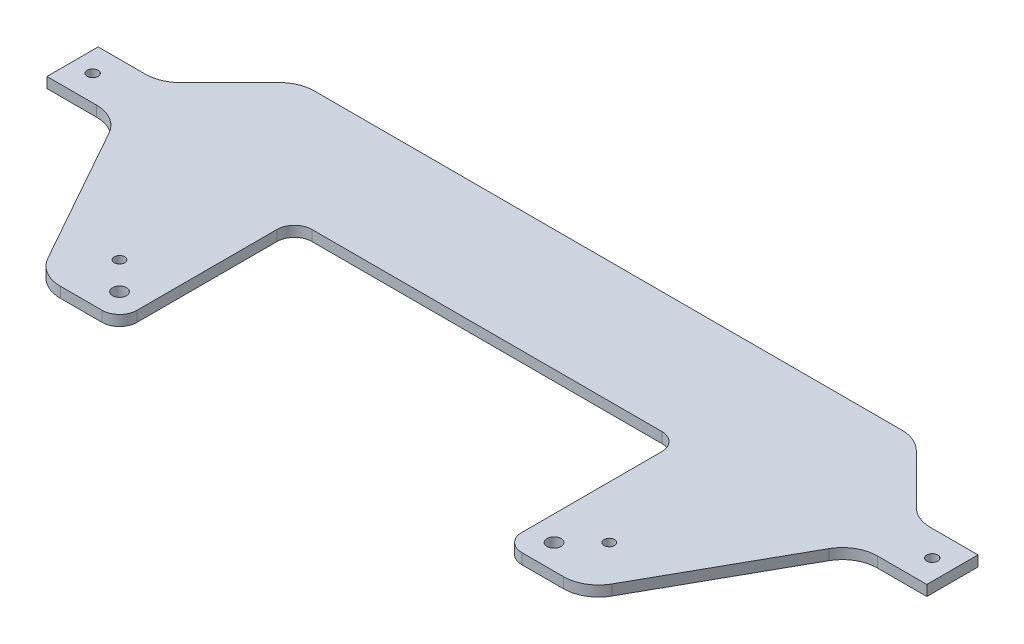
ISO-10303-21;
HEADER;
FILE_DESCRIPTION(('STEP AP214'),'2;1');
FILE_NAME('part.step','',(''),(''),'','','');
FILE_SCHEMA(('AUTOMOTIVE_DESIGN { 1 0 10303 214 1 1 1 1 }'));
ENDSEC;
DATA;
#1=APPLICATION_CONTEXT('core data for automotive mechanical design processes');
#2=APPLICATION_PROTOCOL_DEFINITION('international standard','automotive_design',2000,#1);
#3=PRODUCT_CONTEXT('',#1,'mechanical');
#4=PRODUCT('Part','Part','',(#3));
#5=PRODUCT_RELATED_PRODUCT_CATEGORY('part','',(#4));
#6=PRODUCT_DEFINITION_FORMATION('','',#4);
#7=PRODUCT_DEFINITION_CONTEXT('part definition',#1,'design');
#8=PRODUCT_DEFINITION('design','',#6,#7);
#9=PRODUCT_DEFINITION_SHAPE('','',#8);
#10=(LENGTH_UNIT() NAMED_UNIT(*) SI_UNIT(.MILLI.,.METRE.));
#11=(NAMED_UNIT(*) PLANE_ANGLE_UNIT() SI_UNIT($,.RADIAN.));
#12=(NAMED_UNIT(*) SI_UNIT($,.STERADIAN.) SOLID_ANGLE_UNIT());
#13=UNCERTAINTY_MEASURE_WITH_UNIT(LENGTH_MEASURE(1.E-05),#10,'distance_accuracy_value','');
#14=(GEOMETRIC_REPRESENTATION_CONTEXT(3) GLOBAL_UNCERTAINTY_ASSIGNED_CONTEXT((#13)) GLOBAL_UNIT_ASSIGNED_CONTEXT((#10,
#11,#12)) REPRESENTATION_CONTEXT('',''));
#15=CARTESIAN_POINT('',(0.,0.,0.));
#16=DIRECTION('',(0.,0.,1.));
#17=DIRECTION('',(1.,0.,0.));
#18=AXIS2_PLACEMENT_3D('',#15,#16,#17);
#19=CARTESIAN_POINT('',(-77.75,3.,42.3181711088205));
#20=DIRECTION('',(0.,0.,-1.));
#21=DIRECTION('',(-1.,0.,0.));
#22=AXIS2_PLACEMENT_3D('',#19,#20,#21);
#23=PLANE('',#22);
#24=DIRECTION('',(1.,0.,0.));
#25=VECTOR('',#24,1.);
#26=CARTESIAN_POINT('',(-77.75,0.,42.3181711088205));
#27=LINE('',#26,#25);
#28=CARTESIAN_POINT('',(-71.8887609744845,0.,42.3181711088205));
#29=VERTEX_POINT('',#28);
#30=CARTESIAN_POINT('',(-60.,0.,42.3181711088205));
#31=VERTEX_POINT('',#30);
#32=EDGE_CURVE('E391',#29,#31,#27,.T.);
#33=ORIENTED_EDGE('',*,*,#32,.T.);
#34=DIRECTION('',(0.,1.,0.));
#35=VECTOR('',#34,1.);
#36=CARTESIAN_POINT('',(-60.,3.,42.3181711088205));
#37=LINE('',#36,#35);
#38=CARTESIAN_POINT('',(-60.,3.,42.3181711088205));
#39=VERTEX_POINT('',#38);
#40=EDGE_CURVE('E518',#31,#39,#37,.T.);
#41=ORIENTED_EDGE('',*,*,#40,.T.);
#42=DIRECTION('',(1.,0.,0.));
#43=VECTOR('',#42,1.);
#44=CARTESIAN_POINT('',(-77.75,3.,42.3181711088205));
#45=LINE('',#44,#43);
#46=CARTESIAN_POINT('',(-71.8887609744845,3.,42.3181711088205));
#47=VERTEX_POINT('',#46);
#48=EDGE_CURVE('E352',#47,#39,#45,.T.);
#49=ORIENTED_EDGE('',*,*,#48,.F.);
#50=DIRECTION('',(0.,-1.,0.));
#51=VECTOR('',#50,1.);
#52=CARTESIAN_POINT('',(-71.8887609744845,3.,42.3181711088205));
#53=LINE('',#52,#51);
#54=EDGE_CURVE('E461',#47,#29,#53,.T.);
#55=ORIENTED_EDGE('',*,*,#54,.T.);
#56=EDGE_LOOP('',(#33,#41,#49,#55));
#57=FACE_BOUND('',#56,.T.);
#58=ADVANCED_FACE('F42',(#57),#23,.F.);
#59=CARTESIAN_POINT('',(-88.1,3.,-42.3181711088205));
#60=DIRECTION('',(0.707106781186547,0.,0.707106781186547));
#61=DIRECTION('',(0.707106781186548,0.,-0.707106781186548));
#62=AXIS2_PLACEMENT_3D('',#59,#60,#61);
#63=PLANE('',#62);
#64=DIRECTION('',(-0.707106781186548,0.,0.707106781186548));
#65=VECTOR('',#64,1.);
#66=CARTESIAN_POINT('',(-88.1,3.,-42.3181711088205));
#67=LINE('',#66,#65);
#68=CARTESIAN_POINT('',(-91.0289321881345,3.,-39.389238920686));
#69=VERTEX_POINT('',#68);
#70=CARTESIAN_POINT('',(-105.171067811865,3.,-25.247103296955));
#71=VERTEX_POINT('',#70);
#72=EDGE_CURVE('E345',#69,#71,#67,.T.);
#73=ORIENTED_EDGE('',*,*,#72,.F.);
#74=DIRECTION('',(0.,-1.,0.));
#75=VECTOR('',#74,1.);
#76=CARTESIAN_POINT('',(-91.0289321881345,3.,-39.389238920686));
#77=LINE('',#76,#75);
#78=CARTESIAN_POINT('',(-91.0289321881345,0.,-39.389238920686));
#79=VERTEX_POINT('',#78);
#80=EDGE_CURVE('E455',#69,#79,#77,.T.);
#81=ORIENTED_EDGE('',*,*,#80,.T.);
#82=DIRECTION('',(-0.707106781186548,0.,0.707106781186548));
#83=VECTOR('',#82,1.);
#84=CARTESIAN_POINT('',(-88.1,0.,-42.3181711088205));
#85=LINE('',#84,#83);
#86=CARTESIAN_POINT('',(-105.171067811865,0.,-25.247103296955));
#87=VERTEX_POINT('',#86);
#88=EDGE_CURVE('E339',#79,#87,#85,.T.);
#89=ORIENTED_EDGE('',*,*,#88,.T.);
#90=DIRECTION('',(0.,-1.,0.));
#91=VECTOR('',#90,1.);
#92=CARTESIAN_POINT('',(-105.171067811865,3.,-25.247103296955));
#93=LINE('',#92,#91);
#94=EDGE_CURVE('E448',#87,#71,#93,.F.);
#95=ORIENTED_EDGE('',*,*,#94,.T.);
#96=EDGE_LOOP('',(#73,#81,#89,#95));
#97=FACE_BOUND('',#96,.T.);
#98=ADVANCED_FACE('F608',(#97),#63,.F.);
#99=CARTESIAN_POINT('',(-108.1,3.,-22.3181711088205));
#100=DIRECTION('',(0.,0.,1.));
#101=DIRECTION('',(1.,0.,0.));
#102=AXIS2_PLACEMENT_3D('',#99,#100,#101);
#103=PLANE('',#102);
#104=DIRECTION('',(-1.,0.,0.));
#105=VECTOR('',#104,1.);
#106=CARTESIAN_POINT('',(-108.1,0.,-22.3181711088205));
#107=LINE('',#106,#105);
#108=CARTESIAN_POINT('',(-112.242135623731,0.,-22.3181711088205));
#109=VERTEX_POINT('',#108);
#110=CARTESIAN_POINT('',(-125.75,0.,-22.3181711088205));
#111=VERTEX_POINT('',#110);
#112=EDGE_CURVE('E379',#109,#111,#107,.T.);
#113=ORIENTED_EDGE('',*,*,#112,.T.);
#114=DIRECTION('',(0.,-1.,0.));
#115=VECTOR('',#114,1.);
#116=CARTESIAN_POINT('',(-125.75,3.,-22.3181711088205));
#117=LINE('',#116,#115);
#118=CARTESIAN_POINT('',(-125.75,3.,-22.3181711088205));
#119=VERTEX_POINT('',#118);
#120=EDGE_CURVE('E254',#119,#111,#117,.T.);
#121=ORIENTED_EDGE('',*,*,#120,.F.);
#122=DIRECTION('',(-1.,0.,0.));
#123=VECTOR('',#122,1.);
#124=CARTESIAN_POINT('',(-108.1,3.,-22.3181711088205));
#125=LINE('',#124,#123);
#126=CARTESIAN_POINT('',(-112.242135623731,3.,-22.3181711088205));
#127=VERTEX_POINT('',#126);
#128=EDGE_CURVE('E245',#127,#119,#125,.T.);
#129=ORIENTED_EDGE('',*,*,#128,.F.);
#130=DIRECTION('',(0.,-1.,0.));
#131=VECTOR('',#130,1.);
#132=CARTESIAN_POINT('',(-112.242135623731,0.,-22.3181711088205));
#133=LINE('',#132,#131);
#134=EDGE_CURVE('E490',#127,#109,#133,.T.);
#135=ORIENTED_EDGE('',*,*,#134,.T.);
#136=EDGE_LOOP('',(#113,#121,#129,#135));
#137=FACE_BOUND('',#136,.T.);
#138=ADVANCED_FACE('F598',(#137),#103,.F.);
#139=CARTESIAN_POINT('',(-127.75,3.,-7.6818288911795));
#140=DIRECTION('',(0.,0.,-1.));
#141=DIRECTION('',(-1.,0.,0.));
#142=AXIS2_PLACEMENT_3D('',#139,#140,#141);
#143=PLANE('',#142);
#144=DIRECTION('',(1.,0.,0.));
#145=VECTOR('',#144,1.);
#146=CARTESIAN_POINT('',(-127.75,3.,-7.6818288911795));
#147=LINE('',#146,#145);
#148=CARTESIAN_POINT('',(-125.75,3.,-7.6818288911795));
#149=VERTEX_POINT('',#148);
#150=CARTESIAN_POINT('',(-111.611239025516,3.,-7.6818288911795));
#151=VERTEX_POINT('',#150);
#152=EDGE_CURVE('E233',#149,#151,#147,.T.);
#153=ORIENTED_EDGE('',*,*,#152,.F.);
#154=DIRECTION('',(0.,1.,0.));
#155=VECTOR('',#154,1.);
#156=CARTESIAN_POINT('',(-125.75,0.,-7.6818288911795));
#157=LINE('',#156,#155);
#158=CARTESIAN_POINT('',(-125.75,0.,-7.6818288911795));
#159=VERTEX_POINT('',#158);
#160=EDGE_CURVE('E232',#159,#149,#157,.T.);
#161=ORIENTED_EDGE('',*,*,#160,.F.);
#162=DIRECTION('',(1.,0.,0.));
#163=VECTOR('',#162,1.);
#164=CARTESIAN_POINT('',(-127.75,0.,-7.6818288911795));
#165=LINE('',#164,#163);
#166=CARTESIAN_POINT('',(-111.611239025516,0.,-7.6818288911795));
#167=VERTEX_POINT('',#166);
#168=EDGE_CURVE('E384',#159,#167,#165,.T.);
#169=ORIENTED_EDGE('',*,*,#168,.T.);
#170=DIRECTION('',(0.,-1.,0.));
#171=VECTOR('',#170,1.);
#172=CARTESIAN_POINT('',(-111.611239025516,3.,-7.6818288911795));
#173=LINE('',#172,#171);
#174=EDGE_CURVE('E240',#167,#151,#173,.F.);
#175=ORIENTED_EDGE('',*,*,#174,.T.);
#176=EDGE_LOOP('',(#153,#161,#169,#175));
#177=FACE_BOUND('',#176,.T.);
#178=ADVANCED_FACE('F231',(#177),#143,.F.);
#179=CARTESIAN_POINT('',(-105.75,3.,-7.6818288911795));
#180=DIRECTION('',(0.87250601594972,0.,-0.488603368931844));
#181=DIRECTION('',(-0.488603368931844,0.,-0.87250601594972));
#182=AXIS2_PLACEMENT_3D('',#179,#180,#181);
#183=PLANE('',#182);
#184=DIRECTION('',(0.488603368931844,0.,0.87250601594972));
#185=VECTOR('',#184,1.);
#186=CARTESIAN_POINT('',(-105.75,0.,-7.6818288911795));
#187=LINE('',#186,#185);
#188=CARTESIAN_POINT('',(-102.886178866018,0.,-2.56786258049794));
#189=VERTEX_POINT('',#188);
#190=CARTESIAN_POINT('',(-80.6138211339817,0.,37.2042047981389));
#191=VERTEX_POINT('',#190);
#192=EDGE_CURVE('E389',#189,#191,#187,.T.);
#193=ORIENTED_EDGE('',*,*,#192,.T.);
#194=DIRECTION('',(0.,-1.,0.));
#195=VECTOR('',#194,1.);
#196=CARTESIAN_POINT('',(-80.6138211339817,3.,37.2042047981389));
#197=LINE('',#196,#195);
#198=CARTESIAN_POINT('',(-80.6138211339817,3.,37.2042047981389));
#199=VERTEX_POINT('',#198);
#200=EDGE_CURVE('E469',#191,#199,#197,.F.);
#201=ORIENTED_EDGE('',*,*,#200,.T.);
#202=DIRECTION('',(0.488603368931844,0.,0.87250601594972));
#203=VECTOR('',#202,1.);
#204=CARTESIAN_POINT('',(-105.75,3.,-7.6818288911795));
#205=LINE('',#204,#203);
#206=CARTESIAN_POINT('',(-102.886178866018,3.,-2.56786258049794));
#207=VERTEX_POINT('',#206);
#208=EDGE_CURVE('E241',#207,#199,#205,.T.);
#209=ORIENTED_EDGE('',*,*,#208,.F.);
#210=DIRECTION('',(0.,-1.,0.));
#211=VECTOR('',#210,1.);
#212=CARTESIAN_POINT('',(-102.886178866018,0.,-2.56786258049794));
#213=LINE('',#212,#211);
#214=EDGE_CURVE('E464',#207,#189,#213,.T.);
#215=ORIENTED_EDGE('',*,*,#214,.T.);
#216=EDGE_LOOP('',(#193,#201,#209,#215));
#217=FACE_BOUND('',#216,.T.);
#218=ADVANCED_FACE('F595',(#217),#183,.F.);
#219=CARTESIAN_POINT('',(60.,3.,42.3181711088205));
#220=VERTEX_POINT('',#219);
#221=CARTESIAN_POINT('',(71.8887609744845,3.,42.3181711088205));
#222=VERTEX_POINT('',#221);
#223=EDGE_CURVE('E353',#220,#222,#45,.T.);
#224=ORIENTED_EDGE('',*,*,#223,.F.);
#225=DIRECTION('',(0.,1.,0.));
#226=VECTOR('',#225,1.);
#227=CARTESIAN_POINT('',(60.,3.,42.3181711088205));
#228=LINE('',#227,#226);
#229=CARTESIAN_POINT('',(60.,0.,42.3181711088205));
#230=VERTEX_POINT('',#229);
#231=EDGE_CURVE('E550',#220,#230,#228,.F.);
#232=ORIENTED_EDGE('',*,*,#231,.T.);
#233=CARTESIAN_POINT('',(71.8887609744845,0.,42.3181711088205));
#234=VERTEX_POINT('',#233);
#235=EDGE_CURVE('E387',#230,#234,#27,.T.);
#236=ORIENTED_EDGE('',*,*,#235,.T.);
#237=DIRECTION('',(0.,-1.,0.));
#238=VECTOR('',#237,1.);
#239=CARTESIAN_POINT('',(71.8887609744845,3.,42.3181711088205));
#240=LINE('',#239,#238);
#241=EDGE_CURVE('E460',#234,#222,#240,.F.);
#242=ORIENTED_EDGE('',*,*,#241,.T.);
#243=EDGE_LOOP('',(#224,#232,#236,#242));
#244=FACE_BOUND('',#243,.T.);
#245=ADVANCED_FACE('F678',(#244),#23,.F.);
#246=CARTESIAN_POINT('',(105.75,3.,-7.6818288911795));
#247=DIRECTION('',(-0.87250601594972,0.,-0.488603368931844));
#248=DIRECTION('',(-0.488603368931844,0.,0.87250601594972));
#249=AXIS2_PLACEMENT_3D('',#246,#247,#248);
#250=PLANE('',#249);
#251=DIRECTION('',(0.488603368931844,0.,-0.87250601594972));
#252=VECTOR('',#251,1.);
#253=CARTESIAN_POINT('',(105.75,3.,-7.6818288911795));
#254=LINE('',#253,#252);
#255=CARTESIAN_POINT('',(80.6138211339817,3.,37.2042047981389));
#256=VERTEX_POINT('',#255);
#257=CARTESIAN_POINT('',(102.886178866018,3.,-2.56786258049794));
#258=VERTEX_POINT('',#257);
#259=EDGE_CURVE('E356',#256,#258,#254,.T.);
#260=ORIENTED_EDGE('',*,*,#259,.F.);
#261=DIRECTION('',(0.,-1.,0.));
#262=VECTOR('',#261,1.);
#263=CARTESIAN_POINT('',(80.6138211339817,3.,37.2042047981389));
#264=LINE('',#263,#262);
#265=CARTESIAN_POINT('',(80.6138211339817,0.,37.2042047981389));
#266=VERTEX_POINT('',#265);
#267=EDGE_CURVE('E472',#256,#266,#264,.T.);
#268=ORIENTED_EDGE('',*,*,#267,.T.);
#269=DIRECTION('',(0.488603368931844,0.,-0.87250601594972));
#270=VECTOR('',#269,1.);
#271=CARTESIAN_POINT('',(105.75,0.,-7.6818288911795));
#272=LINE('',#271,#270);
#273=CARTESIAN_POINT('',(102.886178866018,0.,-2.56786258049794));
#274=VERTEX_POINT('',#273);
#275=EDGE_CURVE('E394',#266,#274,#272,.T.);
#276=ORIENTED_EDGE('',*,*,#275,.T.);
#277=DIRECTION('',(0.,-1.,0.));
#278=VECTOR('',#277,1.);
#279=CARTESIAN_POINT('',(102.886178866018,3.,-2.56786258049794));
#280=LINE('',#279,#278);
#281=EDGE_CURVE('E471',#274,#258,#280,.F.);
#282=ORIENTED_EDGE('',*,*,#281,.T.);
#283=EDGE_LOOP('',(#260,#268,#276,#282));
#284=FACE_BOUND('',#283,.T.);
#285=ADVANCED_FACE('F647',(#284),#250,.F.);
#286=CARTESIAN_POINT('',(127.75,3.,-7.6818288911795));
#287=DIRECTION('',(0.,0.,-1.));
#288=DIRECTION('',(-1.,0.,0.));
#289=AXIS2_PLACEMENT_3D('',#286,#287,#288);
#290=PLANE('',#289);
#291=DIRECTION('',(1.,0.,0.));
#292=VECTOR('',#291,1.);
#293=CARTESIAN_POINT('',(127.75,0.,-7.6818288911795));
#294=LINE('',#293,#292);
#295=CARTESIAN_POINT('',(111.611239025516,0.,-7.6818288911795));
#296=VERTEX_POINT('',#295);
#297=CARTESIAN_POINT('',(125.75,0.,-7.6818288911795));
#298=VERTEX_POINT('',#297);
#299=EDGE_CURVE('E397',#296,#298,#294,.T.);
#300=ORIENTED_EDGE('',*,*,#299,.T.);
#301=DIRECTION('',(0.,-1.,0.));
#302=VECTOR('',#301,1.);
#303=CARTESIAN_POINT('',(125.75,3.,-7.6818288911795));
#304=LINE('',#303,#302);
#305=CARTESIAN_POINT('',(125.75,3.,-7.6818288911795));
#306=VERTEX_POINT('',#305);
#307=EDGE_CURVE('E275',#306,#298,#304,.T.);
#308=ORIENTED_EDGE('',*,*,#307,.F.);
#309=DIRECTION('',(1.,0.,0.));
#310=VECTOR('',#309,1.);
#311=CARTESIAN_POINT('',(127.75,3.,-7.6818288911795));
#312=LINE('',#311,#310);
#313=CARTESIAN_POINT('',(111.611239025516,3.,-7.6818288911795));
#314=VERTEX_POINT('',#313);
#315=EDGE_CURVE('E365',#314,#306,#312,.T.);
#316=ORIENTED_EDGE('',*,*,#315,.F.);
#317=DIRECTION('',(0.,-1.,0.));
#318=VECTOR('',#317,1.);
#319=CARTESIAN_POINT('',(111.611239025516,0.,-7.6818288911795));
#320=LINE('',#319,#318);
#321=EDGE_CURVE('E483',#314,#296,#320,.T.);
#322=ORIENTED_EDGE('',*,*,#321,.T.);
#323=EDGE_LOOP('',(#300,#308,#316,#322));
#324=FACE_BOUND('',#323,.T.);
#325=ADVANCED_FACE('F644',(#324),#290,.F.);
#326=CARTESIAN_POINT('',(108.1,3.,-22.3181711088205));
#327=DIRECTION('',(0.,0.,1.));
#328=DIRECTION('',(1.,0.,0.));
#329=AXIS2_PLACEMENT_3D('',#326,#327,#328);
#330=PLANE('',#329);
#331=DIRECTION('',(-1.,0.,0.));
#332=VECTOR('',#331,1.);
#333=CARTESIAN_POINT('',(108.1,3.,-22.3181711088205));
#334=LINE('',#333,#332);
#335=CARTESIAN_POINT('',(125.75,3.,-22.3181711088205));
#336=VERTEX_POINT('',#335);
#337=CARTESIAN_POINT('',(112.242135623731,3.,-22.3181711088205));
#338=VERTEX_POINT('',#337);
#339=EDGE_CURVE('E362',#336,#338,#334,.T.);
#340=ORIENTED_EDGE('',*,*,#339,.F.);
#341=DIRECTION('',(0.,1.,0.));
#342=VECTOR('',#341,1.);
#343=CARTESIAN_POINT('',(125.75,3.,-22.3181711088205));
#344=LINE('',#343,#342);
#345=CARTESIAN_POINT('',(125.75,0.,-22.3181711088205));
#346=VERTEX_POINT('',#345);
#347=EDGE_CURVE('E277',#346,#336,#344,.T.);
#348=ORIENTED_EDGE('',*,*,#347,.F.);
#349=DIRECTION('',(-1.,0.,0.));
#350=VECTOR('',#349,1.);
#351=CARTESIAN_POINT('',(108.1,0.,-22.3181711088205));
#352=LINE('',#351,#350);
#353=CARTESIAN_POINT('',(112.242135623731,0.,-22.3181711088205));
#354=VERTEX_POINT('',#353);
#355=EDGE_CURVE('E405',#346,#354,#352,.T.);
#356=ORIENTED_EDGE('',*,*,#355,.T.);
#357=DIRECTION('',(0.,-1.,0.));
#358=VECTOR('',#357,1.);
#359=CARTESIAN_POINT('',(112.242135623731,3.,-22.3181711088205));
#360=LINE('',#359,#358);
#361=EDGE_CURVE('E477',#354,#338,#360,.F.);
#362=ORIENTED_EDGE('',*,*,#361,.T.);
#363=EDGE_LOOP('',(#340,#348,#356,#362));
#364=FACE_BOUND('',#363,.T.);
#365=ADVANCED_FACE('F639',(#364),#330,.F.);
#366=CARTESIAN_POINT('',(88.1,3.,-42.3181711088205));
#367=DIRECTION('',(-0.707106781186547,0.,0.707106781186547));
#368=DIRECTION('',(0.707106781186548,0.,0.707106781186548));
#369=AXIS2_PLACEMENT_3D('',#366,#367,#368);
#370=PLANE('',#369);
#371=DIRECTION('',(-0.707106781186548,0.,-0.707106781186548));
#372=VECTOR('',#371,1.);
#373=CARTESIAN_POINT('',(88.1,0.,-42.3181711088205));
#374=LINE('',#373,#372);
#375=CARTESIAN_POINT('',(105.171067811865,0.,-25.247103296955));
#376=VERTEX_POINT('',#375);
#377=CARTESIAN_POINT('',(91.0289321881345,0.,-39.389238920686));
#378=VERTEX_POINT('',#377);
#379=EDGE_CURVE('E403',#376,#378,#374,.T.);
#380=ORIENTED_EDGE('',*,*,#379,.T.);
#381=DIRECTION('',(0.,-1.,0.));
#382=VECTOR('',#381,1.);
#383=CARTESIAN_POINT('',(91.0289321881345,3.,-39.389238920686));
#384=LINE('',#383,#382);
#385=CARTESIAN_POINT('',(91.0289321881345,3.,-39.389238920686));
#386=VERTEX_POINT('',#385);
#387=EDGE_CURVE('E434',#378,#386,#384,.F.);
#388=ORIENTED_EDGE('',*,*,#387,.T.);
#389=DIRECTION('',(-0.707106781186548,0.,-0.707106781186548));
#390=VECTOR('',#389,1.);
#391=CARTESIAN_POINT('',(88.1,3.,-42.3181711088205));
#392=LINE('',#391,#390);
#393=CARTESIAN_POINT('',(105.171067811865,3.,-25.247103296955));
#394=VERTEX_POINT('',#393);
#395=EDGE_CURVE('E368',#394,#386,#392,.T.);
#396=ORIENTED_EDGE('',*,*,#395,.F.);
#397=DIRECTION('',(0.,-1.,0.));
#398=VECTOR('',#397,1.);
#399=CARTESIAN_POINT('',(105.171067811865,0.,-25.247103296955));
#400=LINE('',#399,#398);
#401=EDGE_CURVE('E431',#394,#376,#400,.T.);
#402=ORIENTED_EDGE('',*,*,#401,.T.);
#403=EDGE_LOOP('',(#380,#388,#396,#402));
#404=FACE_BOUND('',#403,.T.);
#405=ADVANCED_FACE('F622',(#404),#370,.F.);
#406=CARTESIAN_POINT('',(-88.1,3.,-42.3181711088205));
#407=DIRECTION('',(0.,0.,1.));
#408=DIRECTION('',(1.,0.,0.));
#409=AXIS2_PLACEMENT_3D('',#406,#407,#408);
#410=PLANE('',#409);
#411=DIRECTION('',(-1.,0.,0.));
#412=VECTOR('',#411,1.);
#413=CARTESIAN_POINT('',(-88.1,3.,-42.3181711088205));
#414=LINE('',#413,#412);
#415=CARTESIAN_POINT('',(83.9578643762691,3.,-42.3181711088205));
#416=VERTEX_POINT('',#415);
#417=CARTESIAN_POINT('',(-83.9578643762691,3.,-42.3181711088205));
#418=VERTEX_POINT('',#417);
#419=EDGE_CURVE('E375',#416,#418,#414,.T.);
#420=ORIENTED_EDGE('',*,*,#419,.F.);
#421=DIRECTION('',(0.,-1.,0.));
#422=VECTOR('',#421,1.);
#423=CARTESIAN_POINT('',(83.9578643762691,3.,-42.3181711088205));
#424=LINE('',#423,#422);
#425=CARTESIAN_POINT('',(83.9578643762691,0.,-42.3181711088205));
#426=VERTEX_POINT('',#425);
#427=EDGE_CURVE('E412',#416,#426,#424,.T.);
#428=ORIENTED_EDGE('',*,*,#427,.T.);
#429=DIRECTION('',(-1.,0.,0.));
#430=VECTOR('',#429,1.);
#431=CARTESIAN_POINT('',(-88.1,0.,-42.3181711088205));
#432=LINE('',#431,#430);
#433=CARTESIAN_POINT('',(-83.9578643762691,0.,-42.3181711088205));
#434=VERTEX_POINT('',#433);
#435=EDGE_CURVE('E350',#426,#434,#432,.T.);
#436=ORIENTED_EDGE('',*,*,#435,.T.);
#437=DIRECTION('',(0.,-1.,0.));
#438=VECTOR('',#437,1.);
#439=CARTESIAN_POINT('',(-83.9578643762691,3.,-42.3181711088205));
#440=LINE('',#439,#438);
#441=EDGE_CURVE('E376',#434,#418,#440,.F.);
#442=ORIENTED_EDGE('',*,*,#441,.T.);
#443=EDGE_LOOP('',(#420,#428,#436,#442));
#444=FACE_BOUND('',#443,.T.);
#445=ADVANCED_FACE('F617',(#444),#410,.F.);
#446=CARTESIAN_POINT('',(0.,3.,0.));
#447=DIRECTION('',(0.,1.,0.));
#448=DIRECTION('',(0.,0.,1.));
#449=AXIS2_PLACEMENT_3D('',#446,#447,#448);
#450=PLANE('',#449);
#451=CARTESIAN_POINT('',(62.1,3.,35.21817110882));
#452=DIRECTION('',(0.,-1.,0.));
#453=DIRECTION('',(0.,0.,1.));
#454=AXIS2_PLACEMENT_3D('',#451,#452,#453);
#455=CIRCLE('',#454,2.);
#456=CARTESIAN_POINT('',(62.1,3.,37.21817110882));
#457=VERTEX_POINT('',#456);
#458=EDGE_CURVE('E1001',#457,#457,#455,.T.);
#459=ORIENTED_EDGE('',*,*,#458,.T.);
#460=EDGE_LOOP('',(#459));
#461=FACE_BOUND('',#460,.T.);
#462=CARTESIAN_POINT('',(-62.1,3.,35.21817110882));
#463=DIRECTION('',(0.,1.,0.));
#464=DIRECTION('',(0.,0.,1.));
#465=AXIS2_PLACEMENT_3D('',#462,#463,#464);
#466=CIRCLE('',#465,2.);
#467=CARTESIAN_POINT('',(-62.1,3.,37.21817110882));
#468=VERTEX_POINT('',#467);
#469=EDGE_CURVE('E262',#468,#468,#466,.T.);
#470=ORIENTED_EDGE('',*,*,#469,.F.);
#471=EDGE_LOOP('',(#470));
#472=FACE_BOUND('',#471,.T.);
#473=ORIENTED_EDGE('',*,*,#128,.T.);
#474=DIRECTION('',(0.,0.,-1.));
#475=VECTOR('',#474,1.);
#476=CARTESIAN_POINT('',(-125.75,3.,-7.6818288911795));
#477=LINE('',#476,#475);
#478=EDGE_CURVE('E244',#149,#119,#477,.T.);
#479=ORIENTED_EDGE('',*,*,#478,.F.);
#480=ORIENTED_EDGE('',*,*,#152,.T.);
#481=CARTESIAN_POINT('',(-111.611239025516,3.,2.3181711088205));
#482=DIRECTION('',(0.,1.,0.));
#483=DIRECTION('',(0.,0.,1.));
#484=AXIS2_PLACEMENT_3D('',#481,#482,#483);
#485=CIRCLE('',#484,10.);
#486=EDGE_CURVE('E509',#151,#207,#485,.F.);
#487=ORIENTED_EDGE('',*,*,#486,.T.);
#488=ORIENTED_EDGE('',*,*,#208,.T.);
#489=CARTESIAN_POINT('',(-71.8887609744845,3.,32.3181711088205));
#490=DIRECTION('',(0.,1.,0.));
#491=DIRECTION('',(0.,0.,1.));
#492=AXIS2_PLACEMENT_3D('',#489,#490,#491);
#493=CIRCLE('',#492,10.);
#494=EDGE_CURVE('E441',#199,#47,#493,.T.);
#495=ORIENTED_EDGE('',*,*,#494,.T.);
#496=ORIENTED_EDGE('',*,*,#48,.T.);
#497=CARTESIAN_POINT('',(-60.,3.,37.3181711088205));
#498=DIRECTION('',(0.,1.,0.));
#499=DIRECTION('',(0.,0.,1.));
#500=AXIS2_PLACEMENT_3D('',#497,#498,#499);
#501=CIRCLE('',#500,5.);
#502=CARTESIAN_POINT('',(-55.,3.,37.3181711088205));
#503=VERTEX_POINT('',#502);
#504=EDGE_CURVE('E526',#39,#503,#501,.T.);
#505=ORIENTED_EDGE('',*,*,#504,.T.);
#506=DIRECTION('',(0.,0.,1.));
#507=VECTOR('',#506,1.);
#508=CARTESIAN_POINT('',(-55.,3.,42.3181711088205));
#509=LINE('',#508,#507);
#510=CARTESIAN_POINT('',(-55.,3.,-2.68182889117948));
#511=VERTEX_POINT('',#510);
#512=EDGE_CURVE('E291',#511,#503,#509,.T.);
#513=ORIENTED_EDGE('',*,*,#512,.F.);
#514=CARTESIAN_POINT('',(-50.,3.,-2.68182889117948));
#515=DIRECTION('',(0.,1.,0.));
#516=DIRECTION('',(0.,0.,1.));
#517=AXIS2_PLACEMENT_3D('',#514,#515,#516);
#518=CIRCLE('',#517,5.);
#519=CARTESIAN_POINT('',(-50.,3.,-7.68182889117949));
#520=VERTEX_POINT('',#519);
#521=EDGE_CURVE('E52',#511,#520,#518,.F.);
#522=ORIENTED_EDGE('',*,*,#521,.T.);
#523=DIRECTION('',(-1.,0.,0.));
#524=VECTOR('',#523,1.);
#525=CARTESIAN_POINT('',(-55.,3.,-7.68182889117949));
#526=LINE('',#525,#524);
#527=CARTESIAN_POINT('',(50.,3.,-7.68182889117949));
#528=VERTEX_POINT('',#527);
#529=EDGE_CURVE('E302',#528,#520,#526,.T.);
#530=ORIENTED_EDGE('',*,*,#529,.F.);
#531=CARTESIAN_POINT('',(50.,3.,-2.68182889117949));
#532=DIRECTION('',(0.,1.,0.));
#533=DIRECTION('',(0.,0.,1.));
#534=AXIS2_PLACEMENT_3D('',#531,#532,#533);
#535=CIRCLE('',#534,5.);
#536=CARTESIAN_POINT('',(55.,3.,-2.68182889117949));
#537=VERTEX_POINT('',#536);
#538=EDGE_CURVE('E560',#528,#537,#535,.F.);
#539=ORIENTED_EDGE('',*,*,#538,.T.);
#540=DIRECTION('',(0.,0.,-1.));
#541=VECTOR('',#540,1.);
#542=CARTESIAN_POINT('',(55.,3.,-7.68182889117949));
#543=LINE('',#542,#541);
#544=CARTESIAN_POINT('',(55.,3.,37.3181711088205));
#545=VERTEX_POINT('',#544);
#546=EDGE_CURVE('E288',#545,#537,#543,.T.);
#547=ORIENTED_EDGE('',*,*,#546,.F.);
#548=CARTESIAN_POINT('',(60.,3.,37.3181711088205));
#549=DIRECTION('',(0.,1.,0.));
#550=DIRECTION('',(0.,0.,1.));
#551=AXIS2_PLACEMENT_3D('',#548,#549,#550);
#552=CIRCLE('',#551,5.);
#553=EDGE_CURVE('E523',#545,#220,#552,.T.);
#554=ORIENTED_EDGE('',*,*,#553,.T.);
#555=ORIENTED_EDGE('',*,*,#223,.T.);
#556=CARTESIAN_POINT('',(71.8887609744845,3.,32.3181711088205));
#557=DIRECTION('',(0.,1.,0.));
#558=DIRECTION('',(0.,0.,1.));
#559=AXIS2_PLACEMENT_3D('',#556,#557,#558);
#560=CIRCLE('',#559,10.);
#561=EDGE_CURVE('E438',#222,#256,#560,.T.);
#562=ORIENTED_EDGE('',*,*,#561,.T.);
#563=ORIENTED_EDGE('',*,*,#259,.T.);
#564=CARTESIAN_POINT('',(111.611239025516,3.,2.3181711088205));
#565=DIRECTION('',(0.,1.,0.));
#566=DIRECTION('',(0.,0.,1.));
#567=AXIS2_PLACEMENT_3D('',#564,#565,#566);
#568=CIRCLE('',#567,10.);
#569=EDGE_CURVE('E503',#258,#314,#568,.F.);
#570=ORIENTED_EDGE('',*,*,#569,.T.);
#571=ORIENTED_EDGE('',*,*,#315,.T.);
#572=DIRECTION('',(0.,0.,1.));
#573=VECTOR('',#572,1.);
#574=CARTESIAN_POINT('',(125.75,3.,-7.6818288911795));
#575=LINE('',#574,#573);
#576=EDGE_CURVE('E282',#336,#306,#575,.T.);
#577=ORIENTED_EDGE('',*,*,#576,.F.);
#578=ORIENTED_EDGE('',*,*,#339,.T.);
#579=CARTESIAN_POINT('',(112.242135623731,3.,-32.3181711088205));
#580=DIRECTION('',(0.,1.,0.));
#581=DIRECTION('',(0.,0.,1.));
#582=AXIS2_PLACEMENT_3D('',#579,#580,#581);
#583=CIRCLE('',#582,10.);
#584=EDGE_CURVE('E500',#338,#394,#583,.F.);
#585=ORIENTED_EDGE('',*,*,#584,.T.);
#586=ORIENTED_EDGE('',*,*,#395,.T.);
#587=CARTESIAN_POINT('',(83.9578643762691,3.,-32.3181711088205));
#588=DIRECTION('',(0.,1.,0.));
#589=DIRECTION('',(0.,0.,1.));
#590=AXIS2_PLACEMENT_3D('',#587,#588,#589);
#591=CIRCLE('',#590,10.);
#592=EDGE_CURVE('E450',#386,#416,#591,.T.);
#593=ORIENTED_EDGE('',*,*,#592,.T.);
#594=ORIENTED_EDGE('',*,*,#419,.T.);
#595=CARTESIAN_POINT('',(-83.9578643762691,3.,-32.3181711088205));
#596=DIRECTION('',(0.,1.,0.));
#597=DIRECTION('',(0.,0.,1.));
#598=AXIS2_PLACEMENT_3D('',#595,#596,#597);
#599=CIRCLE('',#598,10.);
#600=EDGE_CURVE('E443',#418,#69,#599,.T.);
#601=ORIENTED_EDGE('',*,*,#600,.T.);
#602=ORIENTED_EDGE('',*,*,#72,.T.);
#603=CARTESIAN_POINT('',(-112.242135623731,3.,-32.3181711088205));
#604=DIRECTION('',(0.,1.,0.));
#605=DIRECTION('',(0.,0.,1.));
#606=AXIS2_PLACEMENT_3D('',#603,#604,#605);
#607=CIRCLE('',#606,10.);
#608=EDGE_CURVE('E519',#71,#127,#607,.F.);
#609=ORIENTED_EDGE('',*,*,#608,.T.);
#610=EDGE_LOOP('',(#473,#479,#480,#487,#488,#495,#496,#505,#513,#522,#530,#539,#547,#554,#555,
#562,#563,#570,#571,#577,#578,#585,#586,#593,#594,#601,#602,#609));
#611=FACE_BOUND('',#610,.T.);
#612=CARTESIAN_POINT('',(-70.,3.,27.3181711088205));
#613=DIRECTION('',(0.,1.,0.));
#614=DIRECTION('',(0.,0.,1.));
#615=AXIS2_PLACEMENT_3D('',#612,#613,#614);
#616=CIRCLE('',#615,1.5);
#617=CARTESIAN_POINT('',(-70.,3.,28.8181711088205));
#618=VERTEX_POINT('',#617);
#619=EDGE_CURVE('E311',#618,#618,#616,.T.);
#620=ORIENTED_EDGE('',*,*,#619,.F.);
#621=EDGE_LOOP('',(#620));
#622=FACE_BOUND('',#621,.T.);
#623=CARTESIAN_POINT('',(-119.996067811865,3.,-15.));
#624=DIRECTION('',(0.,1.,0.));
#625=DIRECTION('',(0.,0.,1.));
#626=AXIS2_PLACEMENT_3D('',#623,#624,#625);
#627=CIRCLE('',#626,1.54999999999999);
#628=CARTESIAN_POINT('',(-119.996067811865,3.,-13.45));
#629=VERTEX_POINT('',#628);
#630=EDGE_CURVE('E318',#629,#629,#627,.T.);
#631=ORIENTED_EDGE('',*,*,#630,.F.);
#632=EDGE_LOOP('',(#631));
#633=FACE_BOUND('',#632,.T.);
#634=CARTESIAN_POINT('',(119.996067811865,3.,-15.));
#635=DIRECTION('',(0.,1.,0.));
#636=DIRECTION('',(0.,0.,1.));
#637=AXIS2_PLACEMENT_3D('',#634,#635,#636);
#638=CIRCLE('',#637,1.54999999999999);
#639=CARTESIAN_POINT('',(119.996067811865,3.,-13.45));
#640=VERTEX_POINT('',#639);
#641=EDGE_CURVE('E328',#640,#640,#638,.T.);
#642=ORIENTED_EDGE('',*,*,#641,.F.);
#643=EDGE_LOOP('',(#642));
#644=FACE_BOUND('',#643,.T.);
#645=CARTESIAN_POINT('',(70.,3.,27.3181711088205));
#646=DIRECTION('',(0.,1.,0.));
#647=DIRECTION('',(0.,0.,1.));
#648=AXIS2_PLACEMENT_3D('',#645,#646,#647);
#649=CIRCLE('',#648,1.5);
#650=CARTESIAN_POINT('',(70.,3.,28.8181711088205));
#651=VERTEX_POINT('',#650);
#652=EDGE_CURVE('E314',#651,#651,#649,.T.);
#653=ORIENTED_EDGE('',*,*,#652,.F.);
#654=EDGE_LOOP('',(#653));
#655=FACE_BOUND('',#654,.T.);
#656=ADVANCED_FACE('F246',(#461,#472,#611,#622,#633,#644,#655),#450,.T.);
#657=CARTESIAN_POINT('',(0.,0.,0.));
#658=DIRECTION('',(0.,1.,0.));
#659=DIRECTION('',(0.,0.,1.));
#660=AXIS2_PLACEMENT_3D('',#657,#658,#659);
#661=PLANE('',#660);
#662=CARTESIAN_POINT('',(62.1,0.,35.21817110882));
#663=DIRECTION('',(0.,-1.,0.));
#664=DIRECTION('',(0.,0.,1.));
#665=AXIS2_PLACEMENT_3D('',#662,#663,#664);
#666=CIRCLE('',#665,2.);
#667=CARTESIAN_POINT('',(62.1,0.,37.21817110882));
#668=VERTEX_POINT('',#667);
#669=EDGE_CURVE('E998',#668,#668,#666,.T.);
#670=ORIENTED_EDGE('',*,*,#669,.F.);
#671=EDGE_LOOP('',(#670));
#672=FACE_BOUND('',#671,.T.);
#673=CARTESIAN_POINT('',(-62.1,0.,35.21817110882));
#674=DIRECTION('',(0.,1.,0.));
#675=DIRECTION('',(0.,0.,1.));
#676=AXIS2_PLACEMENT_3D('',#673,#674,#675);
#677=CIRCLE('',#676,2.);
#678=CARTESIAN_POINT('',(-62.1,0.,37.21817110882));
#679=VERTEX_POINT('',#678);
#680=EDGE_CURVE('E257',#679,#679,#677,.T.);
#681=ORIENTED_EDGE('',*,*,#680,.T.);
#682=EDGE_LOOP('',(#681));
#683=FACE_BOUND('',#682,.T.);
#684=CARTESIAN_POINT('',(-70.,0.,27.3181711088205));
#685=DIRECTION('',(0.,1.,0.));
#686=DIRECTION('',(0.,0.,1.));
#687=AXIS2_PLACEMENT_3D('',#684,#685,#686);
#688=CIRCLE('',#687,1.5);
#689=CARTESIAN_POINT('',(-70.,0.,28.8181711088205));
#690=VERTEX_POINT('',#689);
#691=EDGE_CURVE('E317',#690,#690,#688,.T.);
#692=ORIENTED_EDGE('',*,*,#691,.T.);
#693=EDGE_LOOP('',(#692));
#694=FACE_BOUND('',#693,.T.);
#695=CARTESIAN_POINT('',(-119.996067811865,0.,-15.));
#696=DIRECTION('',(0.,1.,0.));
#697=DIRECTION('',(0.,0.,1.));
#698=AXIS2_PLACEMENT_3D('',#695,#696,#697);
#699=CIRCLE('',#698,1.54999999999999);
#700=CARTESIAN_POINT('',(-119.996067811865,0.,-13.45));
#701=VERTEX_POINT('',#700);
#702=EDGE_CURVE('E323',#701,#701,#699,.T.);
#703=ORIENTED_EDGE('',*,*,#702,.T.);
#704=EDGE_LOOP('',(#703));
#705=FACE_BOUND('',#704,.T.);
#706=CARTESIAN_POINT('',(119.996067811865,0.,-15.));
#707=DIRECTION('',(0.,1.,0.));
#708=DIRECTION('',(0.,0.,1.));
#709=AXIS2_PLACEMENT_3D('',#706,#707,#708);
#710=CIRCLE('',#709,1.54999999999999);
#711=CARTESIAN_POINT('',(119.996067811865,0.,-13.45));
#712=VERTEX_POINT('',#711);
#713=EDGE_CURVE('E301',#712,#712,#710,.T.);
#714=ORIENTED_EDGE('',*,*,#713,.T.);
#715=EDGE_LOOP('',(#714));
#716=FACE_BOUND('',#715,.T.);
#717=CARTESIAN_POINT('',(70.,0.,27.3181711088205));
#718=DIRECTION('',(0.,1.,0.));
#719=DIRECTION('',(0.,0.,1.));
#720=AXIS2_PLACEMENT_3D('',#717,#718,#719);
#721=CIRCLE('',#720,1.5);
#722=CARTESIAN_POINT('',(70.,0.,28.8181711088205));
#723=VERTEX_POINT('',#722);
#724=EDGE_CURVE('E334',#723,#723,#721,.T.);
#725=ORIENTED_EDGE('',*,*,#724,.T.);
#726=EDGE_LOOP('',(#725));
#727=FACE_BOUND('',#726,.T.);
#728=ORIENTED_EDGE('',*,*,#168,.F.);
#729=DIRECTION('',(0.,0.,1.));
#730=VECTOR('',#729,1.);
#731=CARTESIAN_POINT('',(-125.75,0.,-22.3181711088205));
#732=LINE('',#731,#730);
#733=EDGE_CURVE('E260',#111,#159,#732,.T.);
#734=ORIENTED_EDGE('',*,*,#733,.F.);
#735=ORIENTED_EDGE('',*,*,#112,.F.);
#736=CARTESIAN_POINT('',(-112.242135623731,0.,-32.3181711088205));
#737=DIRECTION('',(0.,1.,0.));
#738=DIRECTION('',(0.,0.,1.));
#739=AXIS2_PLACEMENT_3D('',#736,#737,#738);
#740=CIRCLE('',#739,10.);
#741=EDGE_CURVE('E514',#109,#87,#740,.T.);
#742=ORIENTED_EDGE('',*,*,#741,.T.);
#743=ORIENTED_EDGE('',*,*,#88,.F.);
#744=CARTESIAN_POINT('',(-83.9578643762691,0.,-32.3181711088205));
#745=DIRECTION('',(0.,1.,0.));
#746=DIRECTION('',(0.,0.,1.));
#747=AXIS2_PLACEMENT_3D('',#744,#745,#746);
#748=CIRCLE('',#747,10.);
#749=EDGE_CURVE('E424',#79,#434,#748,.F.);
#750=ORIENTED_EDGE('',*,*,#749,.T.);
#751=ORIENTED_EDGE('',*,*,#435,.F.);
#752=CARTESIAN_POINT('',(83.9578643762691,0.,-32.3181711088205));
#753=DIRECTION('',(0.,1.,0.));
#754=DIRECTION('',(0.,0.,1.));
#755=AXIS2_PLACEMENT_3D('',#752,#753,#754);
#756=CIRCLE('',#755,10.);
#757=EDGE_CURVE('E426',#426,#378,#756,.F.);
#758=ORIENTED_EDGE('',*,*,#757,.T.);
#759=ORIENTED_EDGE('',*,*,#379,.F.);
#760=CARTESIAN_POINT('',(112.242135623731,0.,-32.3181711088205));
#761=DIRECTION('',(0.,1.,0.));
#762=DIRECTION('',(0.,0.,1.));
#763=AXIS2_PLACEMENT_3D('',#760,#761,#762);
#764=CIRCLE('',#763,10.);
#765=EDGE_CURVE('E491',#376,#354,#764,.T.);
#766=ORIENTED_EDGE('',*,*,#765,.T.);
#767=ORIENTED_EDGE('',*,*,#355,.F.);
#768=DIRECTION('',(0.,0.,-1.));
#769=VECTOR('',#768,1.);
#770=CARTESIAN_POINT('',(125.75,0.,-22.3181711088205));
#771=LINE('',#770,#769);
#772=EDGE_CURVE('E279',#298,#346,#771,.T.);
#773=ORIENTED_EDGE('',*,*,#772,.F.);
#774=ORIENTED_EDGE('',*,*,#299,.F.);
#775=CARTESIAN_POINT('',(111.611239025516,0.,2.3181711088205));
#776=DIRECTION('',(0.,1.,0.));
#777=DIRECTION('',(0.,0.,1.));
#778=AXIS2_PLACEMENT_3D('',#775,#776,#777);
#779=CIRCLE('',#778,10.);
#780=EDGE_CURVE('E499',#296,#274,#779,.T.);
#781=ORIENTED_EDGE('',*,*,#780,.T.);
#782=ORIENTED_EDGE('',*,*,#275,.F.);
#783=CARTESIAN_POINT('',(71.8887609744845,0.,32.3181711088205));
#784=DIRECTION('',(0.,1.,0.));
#785=DIRECTION('',(0.,0.,1.));
#786=AXIS2_PLACEMENT_3D('',#783,#784,#785);
#787=CIRCLE('',#786,10.);
#788=EDGE_CURVE('E418',#266,#234,#787,.F.);
#789=ORIENTED_EDGE('',*,*,#788,.T.);
#790=ORIENTED_EDGE('',*,*,#235,.F.);
#791=CARTESIAN_POINT('',(60.,0.,37.3181711088205));
#792=DIRECTION('',(0.,1.,0.));
#793=DIRECTION('',(0.,0.,1.));
#794=AXIS2_PLACEMENT_3D('',#791,#792,#793);
#795=CIRCLE('',#794,5.);
#796=CARTESIAN_POINT('',(55.,0.,37.3181711088205));
#797=VERTEX_POINT('',#796);
#798=EDGE_CURVE('E70',#230,#797,#795,.F.);
#799=ORIENTED_EDGE('',*,*,#798,.T.);
#800=DIRECTION('',(0.,0.,-1.));
#801=VECTOR('',#800,1.);
#802=CARTESIAN_POINT('',(55.,0.,-7.68182889117949));
#803=LINE('',#802,#801);
#804=CARTESIAN_POINT('',(55.,0.,-2.68182889117949));
#805=VERTEX_POINT('',#804);
#806=EDGE_CURVE('E287',#797,#805,#803,.T.);
#807=ORIENTED_EDGE('',*,*,#806,.T.);
#808=CARTESIAN_POINT('',(50.,0.,-2.68182889117949));
#809=DIRECTION('',(0.,1.,0.));
#810=DIRECTION('',(0.,0.,1.));
#811=AXIS2_PLACEMENT_3D('',#808,#809,#810);
#812=CIRCLE('',#811,5.);
#813=CARTESIAN_POINT('',(50.,0.,-7.68182889117949));
#814=VERTEX_POINT('',#813);
#815=EDGE_CURVE('E557',#805,#814,#812,.T.);
#816=ORIENTED_EDGE('',*,*,#815,.T.);
#817=DIRECTION('',(-1.,0.,0.));
#818=VECTOR('',#817,1.);
#819=CARTESIAN_POINT('',(-55.,0.,-7.68182889117949));
#820=LINE('',#819,#818);
#821=CARTESIAN_POINT('',(-50.,0.,-7.68182889117949));
#822=VERTEX_POINT('',#821);
#823=EDGE_CURVE('E292',#814,#822,#820,.T.);
#824=ORIENTED_EDGE('',*,*,#823,.T.);
#825=CARTESIAN_POINT('',(-50.,0.,-2.68182889117948));
#826=DIRECTION('',(0.,1.,0.));
#827=DIRECTION('',(0.,0.,1.));
#828=AXIS2_PLACEMENT_3D('',#825,#826,#827);
#829=CIRCLE('',#828,5.);
#830=CARTESIAN_POINT('',(-55.,0.,-2.68182889117948));
#831=VERTEX_POINT('',#830);
#832=EDGE_CURVE('E11',#822,#831,#829,.T.);
#833=ORIENTED_EDGE('',*,*,#832,.T.);
#834=DIRECTION('',(0.,0.,1.));
#835=VECTOR('',#834,1.);
#836=CARTESIAN_POINT('',(-55.,0.,42.3181711088205));
#837=LINE('',#836,#835);
#838=CARTESIAN_POINT('',(-55.,0.,37.3181711088205));
#839=VERTEX_POINT('',#838);
#840=EDGE_CURVE('E300',#831,#839,#837,.T.);
#841=ORIENTED_EDGE('',*,*,#840,.T.);
#842=CARTESIAN_POINT('',(-60.,0.,37.3181711088205));
#843=DIRECTION('',(0.,1.,0.));
#844=DIRECTION('',(0.,0.,1.));
#845=AXIS2_PLACEMENT_3D('',#842,#843,#844);
#846=CIRCLE('',#845,5.);
#847=EDGE_CURVE('E540',#839,#31,#846,.F.);
#848=ORIENTED_EDGE('',*,*,#847,.T.);
#849=ORIENTED_EDGE('',*,*,#32,.F.);
#850=CARTESIAN_POINT('',(-71.8887609744845,0.,32.3181711088205));
#851=DIRECTION('',(0.,1.,0.));
#852=DIRECTION('',(0.,0.,1.));
#853=AXIS2_PLACEMENT_3D('',#850,#851,#852);
#854=CIRCLE('',#853,10.);
#855=EDGE_CURVE('E422',#29,#191,#854,.F.);
#856=ORIENTED_EDGE('',*,*,#855,.T.);
#857=ORIENTED_EDGE('',*,*,#192,.F.);
#858=CARTESIAN_POINT('',(-111.611239025516,0.,2.3181711088205));
#859=DIRECTION('',(0.,1.,0.));
#860=DIRECTION('',(0.,0.,1.));
#861=AXIS2_PLACEMENT_3D('',#858,#859,#860);
#862=CIRCLE('',#861,10.);
#863=EDGE_CURVE('E506',#189,#167,#862,.T.);
#864=ORIENTED_EDGE('',*,*,#863,.T.);
#865=EDGE_LOOP('',(#728,#734,#735,#742,#743,#750,#751,#758,#759,#766,#767,#773,#774,#781,#782,
#789,#790,#799,#807,#816,#824,#833,#841,#848,#849,#856,#857,#864));
#866=FACE_BOUND('',#865,.T.);
#867=ADVANCED_FACE('F573',(#672,#683,#694,#705,#716,#727,#866),#661,.F.);
#868=CARTESIAN_POINT('',(83.9578643762691,3.,-32.3181711088205));
#869=DIRECTION('',(0.,-1.,0.));
#870=DIRECTION('',(0.,0.,-1.));
#871=AXIS2_PLACEMENT_3D('',#868,#869,#870);
#872=CYLINDRICAL_SURFACE('',#871,10.);
#873=ORIENTED_EDGE('',*,*,#592,.F.);
#874=ORIENTED_EDGE('',*,*,#387,.F.);
#875=ORIENTED_EDGE('',*,*,#757,.F.);
#876=ORIENTED_EDGE('',*,*,#427,.F.);
#877=EDGE_LOOP('',(#873,#874,#875,#876));
#878=FACE_BOUND('',#877,.T.);
#879=ADVANCED_FACE('F623',(#878),#872,.T.);
#880=CARTESIAN_POINT('',(-83.9578643762691,3.,-32.3181711088205));
#881=DIRECTION('',(0.,-1.,0.));
#882=DIRECTION('',(0.,0.,-1.));
#883=AXIS2_PLACEMENT_3D('',#880,#881,#882);
#884=CYLINDRICAL_SURFACE('',#883,10.);
#885=ORIENTED_EDGE('',*,*,#600,.F.);
#886=ORIENTED_EDGE('',*,*,#441,.F.);
#887=ORIENTED_EDGE('',*,*,#749,.F.);
#888=ORIENTED_EDGE('',*,*,#80,.F.);
#889=EDGE_LOOP('',(#885,#886,#887,#888));
#890=FACE_BOUND('',#889,.T.);
#891=ADVANCED_FACE('F612',(#890),#884,.T.);
#892=CARTESIAN_POINT('',(-71.8887609744845,3.,32.3181711088205));
#893=DIRECTION('',(0.,-1.,0.));
#894=DIRECTION('',(0.,0.,-1.));
#895=AXIS2_PLACEMENT_3D('',#892,#893,#894);
#896=CYLINDRICAL_SURFACE('',#895,10.);
#897=ORIENTED_EDGE('',*,*,#494,.F.);
#898=ORIENTED_EDGE('',*,*,#200,.F.);
#899=ORIENTED_EDGE('',*,*,#855,.F.);
#900=ORIENTED_EDGE('',*,*,#54,.F.);
#901=EDGE_LOOP('',(#897,#898,#899,#900));
#902=FACE_BOUND('',#901,.T.);
#903=ADVANCED_FACE('F588',(#902),#896,.T.);
#904=CARTESIAN_POINT('',(71.8887609744845,3.,32.3181711088205));
#905=DIRECTION('',(0.,-1.,0.));
#906=DIRECTION('',(0.,0.,-1.));
#907=AXIS2_PLACEMENT_3D('',#904,#905,#906);
#908=CYLINDRICAL_SURFACE('',#907,10.);
#909=ORIENTED_EDGE('',*,*,#561,.F.);
#910=ORIENTED_EDGE('',*,*,#241,.F.);
#911=ORIENTED_EDGE('',*,*,#788,.F.);
#912=ORIENTED_EDGE('',*,*,#267,.F.);
#913=EDGE_LOOP('',(#909,#910,#911,#912));
#914=FACE_BOUND('',#913,.T.);
#915=ADVANCED_FACE('F656',(#914),#908,.T.);
#916=CARTESIAN_POINT('',(112.242135623731,3.,-32.3181711088205));
#917=DIRECTION('',(0.,1.,0.));
#918=DIRECTION('',(0.,0.,1.));
#919=AXIS2_PLACEMENT_3D('',#916,#917,#918);
#920=CYLINDRICAL_SURFACE('',#919,10.);
#921=ORIENTED_EDGE('',*,*,#584,.F.);
#922=ORIENTED_EDGE('',*,*,#361,.F.);
#923=ORIENTED_EDGE('',*,*,#765,.F.);
#924=ORIENTED_EDGE('',*,*,#401,.F.);
#925=EDGE_LOOP('',(#921,#922,#923,#924));
#926=FACE_BOUND('',#925,.T.);
#927=ADVANCED_FACE('F629',(#926),#920,.F.);
#928=CARTESIAN_POINT('',(111.611239025516,3.,2.3181711088205));
#929=DIRECTION('',(0.,1.,0.));
#930=DIRECTION('',(0.,0.,1.));
#931=AXIS2_PLACEMENT_3D('',#928,#929,#930);
#932=CYLINDRICAL_SURFACE('',#931,10.);
#933=ORIENTED_EDGE('',*,*,#569,.F.);
#934=ORIENTED_EDGE('',*,*,#281,.F.);
#935=ORIENTED_EDGE('',*,*,#780,.F.);
#936=ORIENTED_EDGE('',*,*,#321,.F.);
#937=EDGE_LOOP('',(#933,#934,#935,#936));
#938=FACE_BOUND('',#937,.T.);
#939=ADVANCED_FACE('F653',(#938),#932,.F.);
#940=CARTESIAN_POINT('',(-111.611239025516,3.,2.3181711088205));
#941=DIRECTION('',(0.,1.,0.));
#942=DIRECTION('',(0.,0.,1.));
#943=AXIS2_PLACEMENT_3D('',#940,#941,#942);
#944=CYLINDRICAL_SURFACE('',#943,10.);
#945=ORIENTED_EDGE('',*,*,#486,.F.);
#946=ORIENTED_EDGE('',*,*,#174,.F.);
#947=ORIENTED_EDGE('',*,*,#863,.F.);
#948=ORIENTED_EDGE('',*,*,#214,.F.);
#949=EDGE_LOOP('',(#945,#946,#947,#948));
#950=FACE_BOUND('',#949,.T.);
#951=ADVANCED_FACE('F597',(#950),#944,.F.);
#952=CARTESIAN_POINT('',(-112.242135623731,3.,-32.3181711088205));
#953=DIRECTION('',(0.,1.,0.));
#954=DIRECTION('',(0.,0.,1.));
#955=AXIS2_PLACEMENT_3D('',#952,#953,#954);
#956=CYLINDRICAL_SURFACE('',#955,10.);
#957=ORIENTED_EDGE('',*,*,#608,.F.);
#958=ORIENTED_EDGE('',*,*,#94,.F.);
#959=ORIENTED_EDGE('',*,*,#741,.F.);
#960=ORIENTED_EDGE('',*,*,#134,.F.);
#961=EDGE_LOOP('',(#957,#958,#959,#960));
#962=FACE_BOUND('',#961,.T.);
#963=ADVANCED_FACE('F603',(#962),#956,.F.);
#964=CARTESIAN_POINT('',(70.,0.,27.3181711088205));
#965=DIRECTION('',(0.,1.,0.));
#966=DIRECTION('',(0.,0.,1.));
#967=AXIS2_PLACEMENT_3D('',#964,#965,#966);
#968=CYLINDRICAL_SURFACE('',#967,1.5);
#969=ORIENTED_EDGE('',*,*,#724,.F.);
#970=EDGE_LOOP('',(#969));
#971=FACE_BOUND('',#970,.T.);
#972=ORIENTED_EDGE('',*,*,#652,.T.);
#973=EDGE_LOOP('',(#972));
#974=FACE_BOUND('',#973,.T.);
#975=ADVANCED_FACE('F716',(#971,#974),#968,.F.);
#976=CARTESIAN_POINT('',(119.996067811865,0.,-15.));
#977=DIRECTION('',(0.,1.,0.));
#978=DIRECTION('',(0.,0.,1.));
#979=AXIS2_PLACEMENT_3D('',#976,#977,#978);
#980=CYLINDRICAL_SURFACE('',#979,1.54999999999999);
#981=ORIENTED_EDGE('',*,*,#713,.F.);
#982=EDGE_LOOP('',(#981));
#983=FACE_BOUND('',#982,.T.);
#984=ORIENTED_EDGE('',*,*,#641,.T.);
#985=EDGE_LOOP('',(#984));
#986=FACE_BOUND('',#985,.T.);
#987=ADVANCED_FACE('F733',(#983,#986),#980,.F.);
#988=CARTESIAN_POINT('',(-119.996067811865,0.,-15.));
#989=DIRECTION('',(0.,1.,0.));
#990=DIRECTION('',(0.,0.,1.));
#991=AXIS2_PLACEMENT_3D('',#988,#989,#990);
#992=CYLINDRICAL_SURFACE('',#991,1.54999999999999);
#993=ORIENTED_EDGE('',*,*,#702,.F.);
#994=EDGE_LOOP('',(#993));
#995=FACE_BOUND('',#994,.T.);
#996=ORIENTED_EDGE('',*,*,#630,.T.);
#997=EDGE_LOOP('',(#996));
#998=FACE_BOUND('',#997,.T.);
#999=ADVANCED_FACE('F728',(#995,#998),#992,.F.);
#1000=CARTESIAN_POINT('',(-70.,0.,27.3181711088205));
#1001=DIRECTION('',(0.,1.,0.));
#1002=DIRECTION('',(0.,0.,1.));
#1003=AXIS2_PLACEMENT_3D('',#1000,#1001,#1002);
#1004=CYLINDRICAL_SURFACE('',#1003,1.5);
#1005=ORIENTED_EDGE('',*,*,#691,.F.);
#1006=EDGE_LOOP('',(#1005));
#1007=FACE_BOUND('',#1006,.T.);
#1008=ORIENTED_EDGE('',*,*,#619,.T.);
#1009=EDGE_LOOP('',(#1008));
#1010=FACE_BOUND('',#1009,.T.);
#1011=ADVANCED_FACE('F726',(#1007,#1010),#1004,.F.);
#1012=CARTESIAN_POINT('',(-55.,0.,42.3181711088205));
#1013=DIRECTION('',(-1.,0.,0.));
#1014=DIRECTION('',(0.,0.,1.));
#1015=AXIS2_PLACEMENT_3D('',#1012,#1013,#1014);
#1016=PLANE('',#1015);
#1017=ORIENTED_EDGE('',*,*,#512,.T.);
#1018=DIRECTION('',(0.,1.,0.));
#1019=VECTOR('',#1018,1.);
#1020=CARTESIAN_POINT('',(-55.,0.,37.3181711088205));
#1021=LINE('',#1020,#1019);
#1022=EDGE_CURVE('E531',#503,#839,#1021,.F.);
#1023=ORIENTED_EDGE('',*,*,#1022,.T.);
#1024=ORIENTED_EDGE('',*,*,#840,.F.);
#1025=DIRECTION('',(0.,1.,0.));
#1026=VECTOR('',#1025,1.);
#1027=CARTESIAN_POINT('',(-55.,3.,-2.68182889117948));
#1028=LINE('',#1027,#1026);
#1029=EDGE_CURVE('E527',#831,#511,#1028,.T.);
#1030=ORIENTED_EDGE('',*,*,#1029,.T.);
#1031=EDGE_LOOP('',(#1017,#1023,#1024,#1030));
#1032=FACE_BOUND('',#1031,.T.);
#1033=ADVANCED_FACE('F580',(#1032),#1016,.F.);
#1034=CARTESIAN_POINT('',(-55.,0.,-7.68182889117949));
#1035=DIRECTION('',(0.,0.,-1.));
#1036=DIRECTION('',(-1.,0.,0.));
#1037=AXIS2_PLACEMENT_3D('',#1034,#1035,#1036);
#1038=PLANE('',#1037);
#1039=ORIENTED_EDGE('',*,*,#823,.F.);
#1040=DIRECTION('',(0.,1.,0.));
#1041=VECTOR('',#1040,1.);
#1042=CARTESIAN_POINT('',(50.,3.,-7.68182889117949));
#1043=LINE('',#1042,#1041);
#1044=EDGE_CURVE('E551',#814,#528,#1043,.T.);
#1045=ORIENTED_EDGE('',*,*,#1044,.T.);
#1046=ORIENTED_EDGE('',*,*,#529,.T.);
#1047=DIRECTION('',(0.,1.,0.));
#1048=VECTOR('',#1047,1.);
#1049=CARTESIAN_POINT('',(-50.,0.,-7.68182889117949));
#1050=LINE('',#1049,#1048);
#1051=EDGE_CURVE('E549',#520,#822,#1050,.F.);
#1052=ORIENTED_EDGE('',*,*,#1051,.T.);
#1053=EDGE_LOOP('',(#1039,#1045,#1046,#1052));
#1054=FACE_BOUND('',#1053,.T.);
#1055=ADVANCED_FACE('F569',(#1054),#1038,.F.);
#1056=CARTESIAN_POINT('',(55.,0.,-7.68182889117949));
#1057=DIRECTION('',(1.,0.,0.));
#1058=DIRECTION('',(0.,0.,-1.));
#1059=AXIS2_PLACEMENT_3D('',#1056,#1057,#1058);
#1060=PLANE('',#1059);
#1061=ORIENTED_EDGE('',*,*,#806,.F.);
#1062=DIRECTION('',(0.,1.,0.));
#1063=VECTOR('',#1062,1.);
#1064=CARTESIAN_POINT('',(55.,0.,37.3181711088205));
#1065=LINE('',#1064,#1063);
#1066=EDGE_CURVE('E543',#797,#545,#1065,.T.);
#1067=ORIENTED_EDGE('',*,*,#1066,.T.);
#1068=ORIENTED_EDGE('',*,*,#546,.T.);
#1069=DIRECTION('',(0.,1.,0.));
#1070=VECTOR('',#1069,1.);
#1071=CARTESIAN_POINT('',(55.,0.,-2.68182889117949));
#1072=LINE('',#1071,#1070);
#1073=EDGE_CURVE('E58',#537,#805,#1072,.F.);
#1074=ORIENTED_EDGE('',*,*,#1073,.T.);
#1075=EDGE_LOOP('',(#1061,#1067,#1068,#1074));
#1076=FACE_BOUND('',#1075,.T.);
#1077=ADVANCED_FACE('F663',(#1076),#1060,.F.);
#1078=CARTESIAN_POINT('',(-60.,3.,37.3181711088205));
#1079=DIRECTION('',(0.,1.,0.));
#1080=DIRECTION('',(0.,0.,1.));
#1081=AXIS2_PLACEMENT_3D('',#1078,#1079,#1080);
#1082=CYLINDRICAL_SURFACE('',#1081,5.);
#1083=ORIENTED_EDGE('',*,*,#847,.F.);
#1084=ORIENTED_EDGE('',*,*,#1022,.F.);
#1085=ORIENTED_EDGE('',*,*,#504,.F.);
#1086=ORIENTED_EDGE('',*,*,#40,.F.);
#1087=EDGE_LOOP('',(#1083,#1084,#1085,#1086));
#1088=FACE_BOUND('',#1087,.T.);
#1089=ADVANCED_FACE('F578',(#1088),#1082,.T.);
#1090=CARTESIAN_POINT('',(60.,0.,37.3181711088205));
#1091=DIRECTION('',(0.,1.,0.));
#1092=DIRECTION('',(0.,0.,1.));
#1093=AXIS2_PLACEMENT_3D('',#1090,#1091,#1092);
#1094=CYLINDRICAL_SURFACE('',#1093,5.);
#1095=ORIENTED_EDGE('',*,*,#798,.F.);
#1096=ORIENTED_EDGE('',*,*,#231,.F.);
#1097=ORIENTED_EDGE('',*,*,#553,.F.);
#1098=ORIENTED_EDGE('',*,*,#1066,.F.);
#1099=EDGE_LOOP('',(#1095,#1096,#1097,#1098));
#1100=FACE_BOUND('',#1099,.T.);
#1101=ADVANCED_FACE('F661',(#1100),#1094,.T.);
#1102=CARTESIAN_POINT('',(50.,0.,-2.68182889117949));
#1103=DIRECTION('',(0.,-1.,0.));
#1104=DIRECTION('',(0.,0.,-1.));
#1105=AXIS2_PLACEMENT_3D('',#1102,#1103,#1104);
#1106=CYLINDRICAL_SURFACE('',#1105,5.);
#1107=ORIENTED_EDGE('',*,*,#815,.F.);
#1108=ORIENTED_EDGE('',*,*,#1073,.F.);
#1109=ORIENTED_EDGE('',*,*,#538,.F.);
#1110=ORIENTED_EDGE('',*,*,#1044,.F.);
#1111=EDGE_LOOP('',(#1107,#1108,#1109,#1110));
#1112=FACE_BOUND('',#1111,.T.);
#1113=ADVANCED_FACE('F668',(#1112),#1106,.F.);
#1114=CARTESIAN_POINT('',(-50.,0.,-2.68182889117948));
#1115=DIRECTION('',(0.,-1.,0.));
#1116=DIRECTION('',(0.,0.,-1.));
#1117=AXIS2_PLACEMENT_3D('',#1114,#1115,#1116);
#1118=CYLINDRICAL_SURFACE('',#1117,5.);
#1119=ORIENTED_EDGE('',*,*,#832,.F.);
#1120=ORIENTED_EDGE('',*,*,#1051,.F.);
#1121=ORIENTED_EDGE('',*,*,#521,.F.);
#1122=ORIENTED_EDGE('',*,*,#1029,.F.);
#1123=EDGE_LOOP('',(#1119,#1120,#1121,#1122));
#1124=FACE_BOUND('',#1123,.T.);
#1125=ADVANCED_FACE('F46',(#1124),#1118,.F.);
#1126=CARTESIAN_POINT('',(125.75,0.,0.));
#1127=DIRECTION('',(-1.,0.,0.));
#1128=DIRECTION('',(0.,0.,1.));
#1129=AXIS2_PLACEMENT_3D('',#1126,#1127,#1128);
#1130=PLANE('',#1129);
#1131=ORIENTED_EDGE('',*,*,#307,.T.);
#1132=ORIENTED_EDGE('',*,*,#772,.T.);
#1133=ORIENTED_EDGE('',*,*,#347,.T.);
#1134=ORIENTED_EDGE('',*,*,#576,.T.);
#1135=EDGE_LOOP('',(#1131,#1132,#1133,#1134));
#1136=FACE_BOUND('',#1135,.T.);
#1137=ADVANCED_FACE('F640',(#1136),#1130,.F.);
#1138=CARTESIAN_POINT('',(-125.75,0.,0.));
#1139=DIRECTION('',(-1.,0.,0.));
#1140=DIRECTION('',(0.,0.,1.));
#1141=AXIS2_PLACEMENT_3D('',#1138,#1139,#1140);
#1142=PLANE('',#1141);
#1143=ORIENTED_EDGE('',*,*,#160,.T.);
#1144=ORIENTED_EDGE('',*,*,#478,.T.);
#1145=ORIENTED_EDGE('',*,*,#120,.T.);
#1146=ORIENTED_EDGE('',*,*,#733,.T.);
#1147=EDGE_LOOP('',(#1143,#1144,#1145,#1146));
#1148=FACE_BOUND('',#1147,.T.);
#1149=ADVANCED_FACE('F259',(#1148),#1142,.T.);
#1150=CARTESIAN_POINT('',(-62.1,0.,35.21817110882));
#1151=DIRECTION('',(0.,1.,0.));
#1152=DIRECTION('',(0.,0.,1.));
#1153=AXIS2_PLACEMENT_3D('',#1150,#1151,#1152);
#1154=CYLINDRICAL_SURFACE('',#1153,2.);
#1155=ORIENTED_EDGE('',*,*,#680,.F.);
#1156=EDGE_LOOP('',(#1155));
#1157=FACE_BOUND('',#1156,.T.);
#1158=ORIENTED_EDGE('',*,*,#469,.T.);
#1159=EDGE_LOOP('',(#1158));
#1160=FACE_BOUND('',#1159,.T.);
#1161=ADVANCED_FACE('F792',(#1157,#1160),#1154,.F.);
#1162=CARTESIAN_POINT('',(62.1,0.,35.21817110882));
#1163=DIRECTION('',(0.,1.,0.));
#1164=DIRECTION('',(0.,0.,1.));
#1165=AXIS2_PLACEMENT_3D('',#1162,#1163,#1164);
#1166=CYLINDRICAL_SURFACE('',#1165,2.);
#1167=ORIENTED_EDGE('',*,*,#669,.T.);
#1168=EDGE_LOOP('',(#1167));
#1169=FACE_BOUND('',#1168,.T.);
#1170=ORIENTED_EDGE('',*,*,#458,.F.);
#1171=EDGE_LOOP('',(#1170));
#1172=FACE_BOUND('',#1171,.T.);
#1173=ADVANCED_FACE('F798',(#1169,#1172),#1166,.F.);
#1174=CLOSED_SHELL('',(#58,#98,#138,#178,#218,#245,#285,#325,#365,#405,#445,#656,#867,#879,#891,
#903,#915,#927,#939,#951,#963,#975,#987,#999,#1011,#1033,#1055,#1077,#1089,#1101,#1113,#1125,
#1137,#1149,#1161,#1173));
#1175=MANIFOLD_SOLID_BREP('B2',#1174);
#1176=ADVANCED_BREP_SHAPE_REPRESENTATION('',(#18,#1175),#14);
#1177=SHAPE_DEFINITION_REPRESENTATION(#9,#1176);
ENDSEC;
END-ISO-10303-21;
